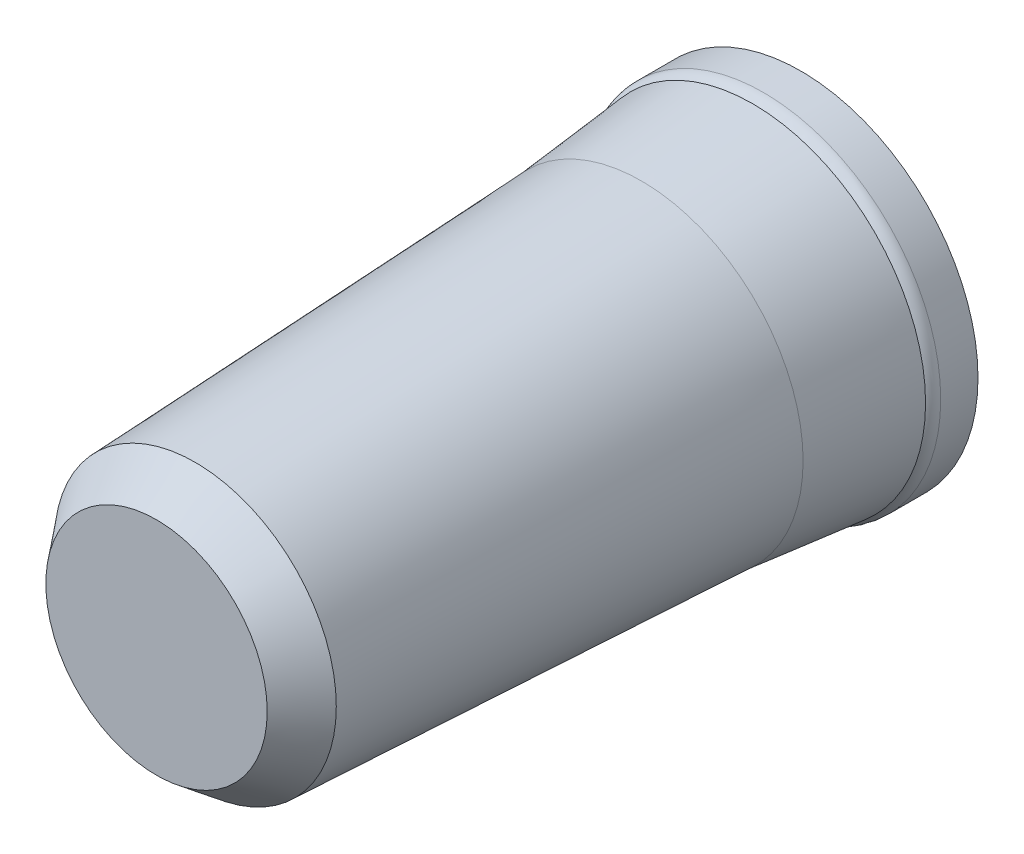
ISO-10303-21;
HEADER;
FILE_DESCRIPTION(('STEP AP214'),'2;1');
FILE_NAME('part.step','',(''),(''),'','','');
FILE_SCHEMA(('AUTOMOTIVE_DESIGN { 1 0 10303 214 1 1 1 1 }'));
ENDSEC;
DATA;
#1=APPLICATION_CONTEXT('core data for automotive mechanical design processes');
#2=APPLICATION_PROTOCOL_DEFINITION('international standard','automotive_design',2000,#1);
#3=PRODUCT_CONTEXT('',#1,'mechanical');
#4=PRODUCT('Part','Part','',(#3));
#5=PRODUCT_RELATED_PRODUCT_CATEGORY('part','',(#4));
#6=PRODUCT_DEFINITION_FORMATION('','',#4);
#7=PRODUCT_DEFINITION_CONTEXT('part definition',#1,'design');
#8=PRODUCT_DEFINITION('design','',#6,#7);
#9=PRODUCT_DEFINITION_SHAPE('','',#8);
#10=(LENGTH_UNIT() NAMED_UNIT(*) SI_UNIT(.MILLI.,.METRE.));
#11=(NAMED_UNIT(*) PLANE_ANGLE_UNIT() SI_UNIT($,.RADIAN.));
#12=(NAMED_UNIT(*) SI_UNIT($,.STERADIAN.) SOLID_ANGLE_UNIT());
#13=UNCERTAINTY_MEASURE_WITH_UNIT(LENGTH_MEASURE(1.E-05),#10,'distance_accuracy_value','');
#14=(GEOMETRIC_REPRESENTATION_CONTEXT(3) GLOBAL_UNCERTAINTY_ASSIGNED_CONTEXT((#13)) GLOBAL_UNIT_ASSIGNED_CONTEXT((#10,
#11,#12)) REPRESENTATION_CONTEXT('',''));
#15=CARTESIAN_POINT('',(0.,0.,0.));
#16=DIRECTION('',(0.,0.,1.));
#17=DIRECTION('',(1.,0.,0.));
#18=AXIS2_PLACEMENT_3D('',#15,#16,#17);
#19=CARTESIAN_POINT('',(0.,0.,0.));
#20=DIRECTION('',(0.,0.,1.));
#21=DIRECTION('',(1.,0.,0.));
#22=AXIS2_PLACEMENT_3D('',#19,#20,#21);
#23=PLANE('',#22);
#24=CARTESIAN_POINT('',(0.,0.,0.));
#25=DIRECTION('',(0.,0.,1.));
#26=DIRECTION('',(1.,0.,0.));
#27=AXIS2_PLACEMENT_3D('',#24,#25,#26);
#28=CIRCLE('',#27,22.1);
#29=CARTESIAN_POINT('',(22.1,0.,0.));
#30=VERTEX_POINT('',#29);
#31=EDGE_CURVE('E10',#30,#30,#28,.T.);
#32=ORIENTED_EDGE('',*,*,#31,.F.);
#33=EDGE_LOOP('',(#32));
#34=FACE_BOUND('',#33,.T.);
#35=ADVANCED_FACE('F36',(#34),#23,.F.);
#36=CARTESIAN_POINT('',(0.,0.,0.));
#37=DIRECTION('',(0.,0.,1.));
#38=DIRECTION('',(1.,0.,0.));
#39=AXIS2_PLACEMENT_3D('',#36,#37,#38);
#40=CYLINDRICAL_SURFACE('',#39,22.1);
#41=CARTESIAN_POINT('',(0.,0.,4.65117263884375));
#42=DIRECTION('',(0.,0.,1.));
#43=DIRECTION('',(1.,0.,0.));
#44=AXIS2_PLACEMENT_3D('',#41,#42,#43);
#45=CIRCLE('',#44,22.1);
#46=CARTESIAN_POINT('',(22.1,0.,4.65117263884375));
#47=VERTEX_POINT('',#46);
#48=EDGE_CURVE('E42',#47,#47,#45,.T.);
#49=ORIENTED_EDGE('',*,*,#48,.F.);
#50=EDGE_LOOP('',(#49));
#51=FACE_BOUND('',#50,.T.);
#52=ORIENTED_EDGE('',*,*,#31,.T.);
#53=EDGE_LOOP('',(#52));
#54=FACE_BOUND('',#53,.T.);
#55=ADVANCED_FACE('F84',(#51,#54),#40,.T.);
#56=CARTESIAN_POINT('',(0.,0.,4.65117263884375));
#57=DIRECTION('',(0.,0.,1.));
#58=DIRECTION('',(1.,0.,0.));
#59=AXIS2_PLACEMENT_3D('',#56,#57,#58);
#60=TOROIDAL_SURFACE('',#59,20.1546125871392,1.9453874128608);
#61=CARTESIAN_POINT('',(0.,0.,5.99878958466411));
#62=DIRECTION('',(0.,0.,1.));
#63=DIRECTION('',(1.,0.,0.));
#64=AXIS2_PLACEMENT_3D('',#61,#62,#63);
#65=CIRCLE('',#64,21.5576310308722);
#66=CARTESIAN_POINT('',(21.5576310308722,0.,5.99878958466411));
#67=VERTEX_POINT('',#66);
#68=EDGE_CURVE('E46',#67,#67,#65,.T.);
#69=ORIENTED_EDGE('',*,*,#68,.F.);
#70=EDGE_LOOP('',(#69));
#71=FACE_BOUND('',#70,.T.);
#72=ORIENTED_EDGE('',*,*,#48,.T.);
#73=EDGE_LOOP('',(#72));
#74=FACE_BOUND('',#73,.T.);
#75=ADVANCED_FACE('F79',(#71,#74),#60,.T.);
#76=CARTESIAN_POINT('',(0.,0.,5.99878958466411));
#77=DIRECTION('',(0.,0.,-1.));
#78=DIRECTION('',(-1.,0.,0.));
#79=AXIS2_PLACEMENT_3D('',#76,#77,#78);
#80=CONICAL_SURFACE('',#79,21.5576310308722,0.100760607181791);
#81=CARTESIAN_POINT('',(0.,0.,19.8759100606262));
#82=DIRECTION('',(0.,0.,1.));
#83=DIRECTION('',(1.,0.,0.));
#84=AXIS2_PLACEMENT_3D('',#81,#82,#83);
#85=CIRCLE('',#84,20.1546125871392);
#86=CARTESIAN_POINT('',(20.1546125871392,0.,19.8759100606262));
#87=VERTEX_POINT('',#86);
#88=EDGE_CURVE('E50',#87,#87,#85,.T.);
#89=ORIENTED_EDGE('',*,*,#88,.F.);
#90=EDGE_LOOP('',(#89));
#91=FACE_BOUND('',#90,.T.);
#92=ORIENTED_EDGE('',*,*,#68,.T.);
#93=EDGE_LOOP('',(#92));
#94=FACE_BOUND('',#93,.T.);
#95=ADVANCED_FACE('F73',(#91,#94),#80,.T.);
#96=CARTESIAN_POINT('',(0.,0.,19.8759100606262));
#97=DIRECTION('',(0.,0.,-1.));
#98=DIRECTION('',(-1.,0.,0.));
#99=AXIS2_PLACEMENT_3D('',#96,#97,#98);
#100=CONICAL_SURFACE('',#99,20.1546125871392,0.0459042703331597);
#101=CARTESIAN_POINT('',(0.,0.,75.5572354428481));
#102=DIRECTION('',(0.,0.,1.));
#103=DIRECTION('',(1.,0.,0.));
#104=AXIS2_PLACEMENT_3D('',#101,#102,#103);
#105=CIRCLE('',#104,17.5968051161445);
#106=CARTESIAN_POINT('',(17.5968051161445,0.,75.5572354428481));
#107=VERTEX_POINT('',#106);
#108=EDGE_CURVE('E55',#107,#107,#105,.T.);
#109=ORIENTED_EDGE('',*,*,#108,.F.);
#110=EDGE_LOOP('',(#109));
#111=FACE_BOUND('',#110,.T.);
#112=ORIENTED_EDGE('',*,*,#88,.T.);
#113=EDGE_LOOP('',(#112));
#114=FACE_BOUND('',#113,.T.);
#115=ADVANCED_FACE('F67',(#111,#114),#100,.T.);
#116=CARTESIAN_POINT('',(0.,0.,75.5572354428481));
#117=DIRECTION('',(0.,0.,-1.));
#118=DIRECTION('',(-1.,0.,0.));
#119=AXIS2_PLACEMENT_3D('',#116,#117,#118);
#120=CONICAL_SURFACE('',#119,17.5968051161445,0.664630984302025);
#121=CARTESIAN_POINT('',(0.,0.,80.39));
#122=DIRECTION('',(0.,0.,1.));
#123=DIRECTION('',(1.,0.,0.));
#124=AXIS2_PLACEMENT_3D('',#121,#122,#123);
#125=CIRCLE('',#124,13.8100821131467);
#126=CARTESIAN_POINT('',(13.8100821131467,0.,80.39));
#127=VERTEX_POINT('',#126);
#128=EDGE_CURVE('E58',#127,#127,#125,.T.);
#129=ORIENTED_EDGE('',*,*,#128,.F.);
#130=EDGE_LOOP('',(#129));
#131=FACE_BOUND('',#130,.T.);
#132=ORIENTED_EDGE('',*,*,#108,.T.);
#133=EDGE_LOOP('',(#132));
#134=FACE_BOUND('',#133,.T.);
#135=ADVANCED_FACE('F64',(#131,#134),#120,.T.);
#136=CARTESIAN_POINT('',(0.,13.8100821131467,80.39));
#137=DIRECTION('',(0.,0.,-1.));
#138=DIRECTION('',(-1.,0.,0.));
#139=AXIS2_PLACEMENT_3D('',#136,#137,#138);
#140=PLANE('',#139);
#141=ORIENTED_EDGE('',*,*,#128,.T.);
#142=EDGE_LOOP('',(#141));
#143=FACE_BOUND('',#142,.T.);
#144=ADVANCED_FACE('F62',(#143),#140,.F.);
#145=CLOSED_SHELL('',(#35,#55,#75,#95,#115,#135,#144));
#146=MANIFOLD_SOLID_BREP('B2',#145);
#147=ADVANCED_BREP_SHAPE_REPRESENTATION('',(#18,#146),#14);
#148=SHAPE_DEFINITION_REPRESENTATION(#9,#147);
ENDSEC;
END-ISO-10303-21;
